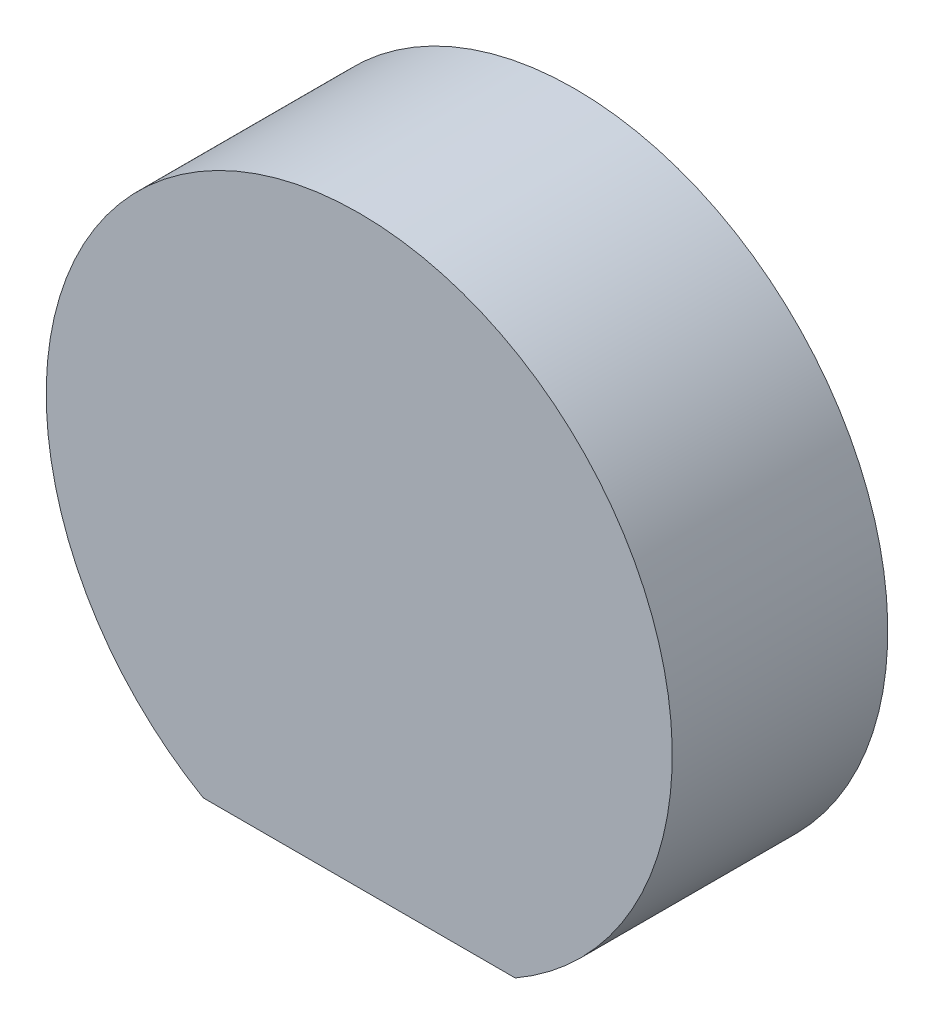
ISO-10303-21;
HEADER;
FILE_DESCRIPTION(('STEP AP214'),'2;1');
FILE_NAME('part.step','',(''),(''),'','','');
FILE_SCHEMA(('AUTOMOTIVE_DESIGN { 1 0 10303 214 1 1 1 1 }'));
ENDSEC;
DATA;
#1=APPLICATION_CONTEXT('core data for automotive mechanical design processes');
#2=APPLICATION_PROTOCOL_DEFINITION('international standard','automotive_design',2000,#1);
#3=PRODUCT_CONTEXT('',#1,'mechanical');
#4=PRODUCT('Part','Part','',(#3));
#5=PRODUCT_RELATED_PRODUCT_CATEGORY('part','',(#4));
#6=PRODUCT_DEFINITION_FORMATION('','',#4);
#7=PRODUCT_DEFINITION_CONTEXT('part definition',#1,'design');
#8=PRODUCT_DEFINITION('design','',#6,#7);
#9=PRODUCT_DEFINITION_SHAPE('','',#8);
#10=(LENGTH_UNIT() NAMED_UNIT(*) SI_UNIT(.MILLI.,.METRE.));
#11=(NAMED_UNIT(*) PLANE_ANGLE_UNIT() SI_UNIT($,.RADIAN.));
#12=(NAMED_UNIT(*) SI_UNIT($,.STERADIAN.) SOLID_ANGLE_UNIT());
#13=UNCERTAINTY_MEASURE_WITH_UNIT(LENGTH_MEASURE(1.E-05),#10,'distance_accuracy_value','');
#14=(GEOMETRIC_REPRESENTATION_CONTEXT(3) GLOBAL_UNCERTAINTY_ASSIGNED_CONTEXT((#13)) GLOBAL_UNIT_ASSIGNED_CONTEXT((#10,
#11,#12)) REPRESENTATION_CONTEXT('',''));
#15=CARTESIAN_POINT('',(0.,0.,0.));
#16=DIRECTION('',(0.,0.,1.));
#17=DIRECTION('',(1.,0.,0.));
#18=AXIS2_PLACEMENT_3D('',#15,#16,#17);
#19=CARTESIAN_POINT('',(0.,-55.4059133967219,44.));
#20=DIRECTION('',(0.,1.,0.));
#21=DIRECTION('',(0.,0.,1.));
#22=AXIS2_PLACEMENT_3D('',#19,#20,#21);
#23=PLANE('',#22);
#24=DIRECTION('',(1.,0.,0.));
#25=VECTOR('',#24,1.);
#26=CARTESIAN_POINT('',(0.,-55.4059133967219,0.));
#27=LINE('',#26,#25);
#28=CARTESIAN_POINT('',(-31.8457301336344,-55.4059133967219,0.));
#29=VERTEX_POINT('',#28);
#30=CARTESIAN_POINT('',(31.8457301336344,-55.4059133967219,0.));
#31=VERTEX_POINT('',#30);
#32=EDGE_CURVE('E78',#29,#31,#27,.T.);
#33=ORIENTED_EDGE('',*,*,#32,.T.);
#34=DIRECTION('',(0.,0.,-1.));
#35=VECTOR('',#34,1.);
#36=CARTESIAN_POINT('',(31.8457301336344,-55.4059133967219,44.));
#37=LINE('',#36,#35);
#38=CARTESIAN_POINT('',(31.8457301336344,-55.4059133967219,44.));
#39=VERTEX_POINT('',#38);
#40=EDGE_CURVE('E11',#39,#31,#37,.T.);
#41=ORIENTED_EDGE('',*,*,#40,.F.);
#42=DIRECTION('',(1.,0.,0.));
#43=VECTOR('',#42,1.);
#44=CARTESIAN_POINT('',(0.,-55.4059133967219,44.));
#45=LINE('',#44,#43);
#46=CARTESIAN_POINT('',(-31.8457301336344,-55.4059133967219,44.));
#47=VERTEX_POINT('',#46);
#48=EDGE_CURVE('E77',#47,#39,#45,.T.);
#49=ORIENTED_EDGE('',*,*,#48,.F.);
#50=DIRECTION('',(0.,0.,-1.));
#51=VECTOR('',#50,1.);
#52=CARTESIAN_POINT('',(-31.8457301336344,-55.4059133967219,44.));
#53=LINE('',#52,#51);
#54=EDGE_CURVE('E55',#47,#29,#53,.T.);
#55=ORIENTED_EDGE('',*,*,#54,.T.);
#56=EDGE_LOOP('',(#33,#41,#49,#55));
#57=FACE_BOUND('',#56,.T.);
#58=ADVANCED_FACE('F47',(#57),#23,.F.);
#59=CARTESIAN_POINT('',(0.,0.,44.));
#60=DIRECTION('',(0.,0.,-1.));
#61=DIRECTION('',(-1.,0.,0.));
#62=AXIS2_PLACEMENT_3D('',#59,#60,#61);
#63=CYLINDRICAL_SURFACE('',#62,63.9059133967219);
#64=CARTESIAN_POINT('',(0.,0.,0.));
#65=DIRECTION('',(0.,0.,1.));
#66=DIRECTION('',(1.,0.,0.));
#67=AXIS2_PLACEMENT_3D('',#64,#65,#66);
#68=CIRCLE('',#67,63.9059133967219);
#69=EDGE_CURVE('E70',#31,#29,#68,.T.);
#70=ORIENTED_EDGE('',*,*,#69,.T.);
#71=ORIENTED_EDGE('',*,*,#54,.F.);
#72=CARTESIAN_POINT('',(0.,0.,44.));
#73=DIRECTION('',(0.,0.,1.));
#74=DIRECTION('',(1.,0.,0.));
#75=AXIS2_PLACEMENT_3D('',#72,#73,#74);
#76=CIRCLE('',#75,63.9059133967219);
#77=EDGE_CURVE('E62',#39,#47,#76,.T.);
#78=ORIENTED_EDGE('',*,*,#77,.F.);
#79=ORIENTED_EDGE('',*,*,#40,.T.);
#80=EDGE_LOOP('',(#70,#71,#78,#79));
#81=FACE_BOUND('',#80,.T.);
#82=ADVANCED_FACE('F73',(#81),#63,.T.);
#83=CARTESIAN_POINT('',(0.,0.,44.));
#84=DIRECTION('',(0.,0.,1.));
#85=DIRECTION('',(1.,0.,0.));
#86=AXIS2_PLACEMENT_3D('',#83,#84,#85);
#87=PLANE('',#86);
#88=ORIENTED_EDGE('',*,*,#48,.T.);
#89=ORIENTED_EDGE('',*,*,#77,.T.);
#90=EDGE_LOOP('',(#88,#89));
#91=FACE_BOUND('',#90,.T.);
#92=ADVANCED_FACE('F85',(#91),#87,.T.);
#93=CARTESIAN_POINT('',(0.,0.,0.));
#94=DIRECTION('',(0.,0.,1.));
#95=DIRECTION('',(1.,0.,0.));
#96=AXIS2_PLACEMENT_3D('',#93,#94,#95);
#97=PLANE('',#96);
#98=ORIENTED_EDGE('',*,*,#32,.F.);
#99=ORIENTED_EDGE('',*,*,#69,.F.);
#100=EDGE_LOOP('',(#98,#99));
#101=FACE_BOUND('',#100,.T.);
#102=ADVANCED_FACE('F81',(#101),#97,.F.);
#103=CLOSED_SHELL('',(#58,#82,#92,#102));
#104=MANIFOLD_SOLID_BREP('B2',#103);
#105=ADVANCED_BREP_SHAPE_REPRESENTATION('',(#18,#104),#14);
#106=SHAPE_DEFINITION_REPRESENTATION(#9,#105);
ENDSEC;
END-ISO-10303-21;
